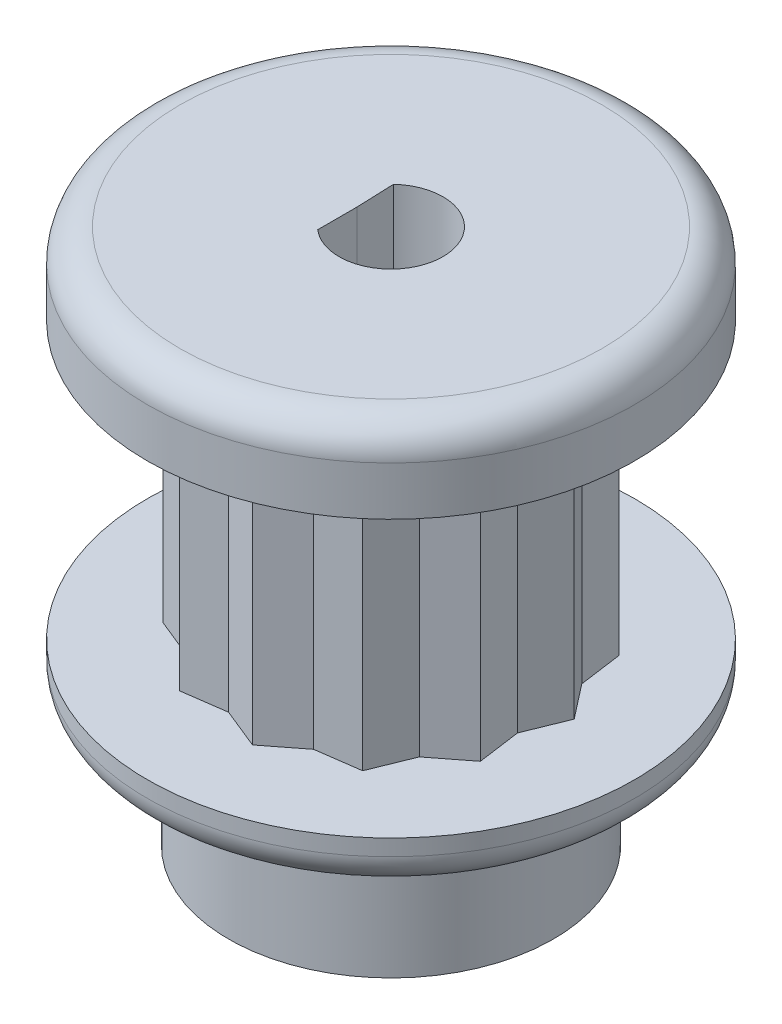
ISO-10303-21;
HEADER;
FILE_DESCRIPTION(('STEP AP214'),'2;1');
FILE_NAME('part.step','',(''),(''),'','','');
FILE_SCHEMA(('AUTOMOTIVE_DESIGN { 1 0 10303 214 1 1 1 1 }'));
ENDSEC;
DATA;
#1=APPLICATION_CONTEXT('core data for automotive mechanical design processes');
#2=APPLICATION_PROTOCOL_DEFINITION('international standard','automotive_design',2000,#1);
#3=PRODUCT_CONTEXT('',#1,'mechanical');
#4=PRODUCT('Part','Part','',(#3));
#5=PRODUCT_RELATED_PRODUCT_CATEGORY('part','',(#4));
#6=PRODUCT_DEFINITION_FORMATION('','',#4);
#7=PRODUCT_DEFINITION_CONTEXT('part definition',#1,'design');
#8=PRODUCT_DEFINITION('design','',#6,#7);
#9=PRODUCT_DEFINITION_SHAPE('','',#8);
#10=(LENGTH_UNIT() NAMED_UNIT(*) SI_UNIT(.MILLI.,.METRE.));
#11=(NAMED_UNIT(*) PLANE_ANGLE_UNIT() SI_UNIT($,.RADIAN.));
#12=(NAMED_UNIT(*) SI_UNIT($,.STERADIAN.) SOLID_ANGLE_UNIT());
#13=UNCERTAINTY_MEASURE_WITH_UNIT(LENGTH_MEASURE(1.E-05),#10,'distance_accuracy_value','');
#14=(GEOMETRIC_REPRESENTATION_CONTEXT(3) GLOBAL_UNCERTAINTY_ASSIGNED_CONTEXT((#13)) GLOBAL_UNIT_ASSIGNED_CONTEXT((#10,
#11,#12)) REPRESENTATION_CONTEXT('',''));
#15=CARTESIAN_POINT('',(0.,0.,0.));
#16=DIRECTION('',(0.,0.,1.));
#17=DIRECTION('',(1.,0.,0.));
#18=AXIS2_PLACEMENT_3D('',#15,#16,#17);
#19=CARTESIAN_POINT('',(4.12927398206627,8.5,-1.74507473002298));
#20=DIRECTION('',(-0.990486823740842,0.,0.13760760151888));
#21=DIRECTION('',(0.13760760151888,0.,0.990486823740842));
#22=AXIS2_PLACEMENT_3D('',#19,#20,#21);
#23=PLANE('',#22);
#24=DIRECTION('',(-0.13760760151888,0.,-0.990486823740842));
#25=VECTOR('',#24,1.);
#26=CARTESIAN_POINT('',(4.12927398206627,0.,-1.74507473002298));
#27=LINE('',#26,#25);
#28=CARTESIAN_POINT('',(4.12927398206627,0.,-1.74507473002298));
#29=VERTEX_POINT('',#28);
#30=CARTESIAN_POINT('',(3.94491475356944,0.,-3.07207545269808));
#31=VERTEX_POINT('',#30);
#32=EDGE_CURVE('E259',#29,#31,#27,.T.);
#33=ORIENTED_EDGE('',*,*,#32,.T.);
#34=DIRECTION('',(0.,-1.,0.));
#35=VECTOR('',#34,1.);
#36=CARTESIAN_POINT('',(3.94491475356944,8.5,-3.07207545269808));
#37=LINE('',#36,#35);
#38=CARTESIAN_POINT('',(3.94491475356944,8.5,-3.07207545269808));
#39=VERTEX_POINT('',#38);
#40=EDGE_CURVE('E253',#39,#31,#37,.T.);
#41=ORIENTED_EDGE('',*,*,#40,.F.);
#42=DIRECTION('',(-0.13760760151888,0.,-0.990486823740842));
#43=VECTOR('',#42,1.);
#44=CARTESIAN_POINT('',(4.12927398206627,8.5,-1.74507473002298));
#45=LINE('',#44,#43);
#46=CARTESIAN_POINT('',(4.12927398206627,8.5,-1.74507473002298));
#47=VERTEX_POINT('',#46);
#48=EDGE_CURVE('E260',#47,#39,#45,.T.);
#49=ORIENTED_EDGE('',*,*,#48,.F.);
#50=DIRECTION('',(0.,-1.,0.));
#51=VECTOR('',#50,1.);
#52=CARTESIAN_POINT('',(4.12927398206627,8.5,-1.74507473002298));
#53=LINE('',#52,#51);
#54=EDGE_CURVE('E333',#47,#29,#53,.T.);
#55=ORIENTED_EDGE('',*,*,#54,.T.);
#56=EDGE_LOOP('',(#33,#41,#49,#55));
#57=FACE_BOUND('',#56,.T.);
#58=ADVANCED_FACE('F33',(#57),#23,.F.);
#59=CARTESIAN_POINT('',(3.94491475356944,8.5,-3.07207545269808));
#60=DIRECTION('',(-0.376071733201224,0.,0.926590552232769));
#61=DIRECTION('',(0.926590552232769,0.,0.376071733201224));
#62=AXIS2_PLACEMENT_3D('',#59,#60,#61);
#63=PLANE('',#62);
#64=DIRECTION('',(-0.926590552232769,0.,-0.376071733201224));
#65=VECTOR('',#64,1.);
#66=CARTESIAN_POINT('',(3.94491475356944,0.,-3.07207545269808));
#67=LINE('',#66,#65);
#68=CARTESIAN_POINT('',(2.70351880264404,0.,-3.57591603873529));
#69=VERTEX_POINT('',#68);
#70=EDGE_CURVE('E336',#31,#69,#67,.T.);
#71=ORIENTED_EDGE('',*,*,#70,.T.);
#72=DIRECTION('',(0.,-1.,0.));
#73=VECTOR('',#72,1.);
#74=CARTESIAN_POINT('',(2.70351880264404,8.5,-3.57591603873529));
#75=LINE('',#74,#73);
#76=CARTESIAN_POINT('',(2.70351880264404,8.5,-3.57591603873529));
#77=VERTEX_POINT('',#76);
#78=EDGE_CURVE('E469',#77,#69,#75,.T.);
#79=ORIENTED_EDGE('',*,*,#78,.F.);
#80=DIRECTION('',(-0.926590552232769,0.,-0.376071733201224));
#81=VECTOR('',#80,1.);
#82=CARTESIAN_POINT('',(3.94491475356944,8.5,-3.07207545269808));
#83=LINE('',#82,#81);
#84=EDGE_CURVE('E263',#39,#77,#83,.T.);
#85=ORIENTED_EDGE('',*,*,#84,.F.);
#86=ORIENTED_EDGE('',*,*,#40,.T.);
#87=EDGE_LOOP('',(#71,#79,#85,#86));
#88=FACE_BOUND('',#87,.T.);
#89=ADVANCED_FACE('F494',(#88),#63,.F.);
#90=CARTESIAN_POINT('',(2.70351880264404,8.5,-3.57591603873529));
#91=DIRECTION('',(-0.788982950713883,0.,0.614415090539624));
#92=DIRECTION('',(0.614415090539624,0.,0.788982950713883));
#93=AXIS2_PLACEMENT_3D('',#90,#91,#92);
#94=PLANE('',#93);
#95=DIRECTION('',(-0.614415090539624,0.,-0.788982950713883));
#96=VECTOR('',#95,1.);
#97=CARTESIAN_POINT('',(2.70351880264404,0.,-3.57591603873529));
#98=LINE('',#97,#96);
#99=CARTESIAN_POINT('',(1.88035866600608,0.,-4.63295276116386));
#100=VERTEX_POINT('',#99);
#101=EDGE_CURVE('E339',#69,#100,#98,.T.);
#102=ORIENTED_EDGE('',*,*,#101,.T.);
#103=DIRECTION('',(0.,-1.,0.));
#104=VECTOR('',#103,1.);
#105=CARTESIAN_POINT('',(1.88035866600608,8.5,-4.63295276116386));
#106=LINE('',#105,#104);
#107=CARTESIAN_POINT('',(1.88035866600608,8.5,-4.63295276116386));
#108=VERTEX_POINT('',#107);
#109=EDGE_CURVE('E466',#108,#100,#106,.T.);
#110=ORIENTED_EDGE('',*,*,#109,.F.);
#111=DIRECTION('',(-0.614415090539624,0.,-0.788982950713883));
#112=VECTOR('',#111,1.);
#113=CARTESIAN_POINT('',(2.70351880264404,8.5,-3.57591603873529));
#114=LINE('',#113,#112);
#115=EDGE_CURVE('E267',#77,#108,#114,.T.);
#116=ORIENTED_EDGE('',*,*,#115,.F.);
#117=ORIENTED_EDGE('',*,*,#78,.T.);
#118=EDGE_LOOP('',(#102,#110,#116,#117));
#119=FACE_BOUND('',#118,.T.);
#120=ADVANCED_FACE('F500',(#119),#94,.F.);
#121=CARTESIAN_POINT('',(1.88035866600608,8.5,-4.63295276116386));
#122=DIRECTION('',(0.137607601518888,0.,0.990486823740841));
#123=DIRECTION('',(0.990486823740841,0.,-0.137607601518888));
#124=AXIS2_PLACEMENT_3D('',#121,#122,#123);
#125=PLANE('',#124);
#126=DIRECTION('',(-0.990486823740841,0.,0.137607601518888));
#127=VECTOR('',#126,1.);
#128=CARTESIAN_POINT('',(1.88035866600608,0.,-4.63295276116386));
#129=LINE('',#128,#127);
#130=CARTESIAN_POINT('',(0.553357943330975,0.,-4.44859353266701));
#131=VERTEX_POINT('',#130);
#132=EDGE_CURVE('E342',#100,#131,#129,.T.);
#133=ORIENTED_EDGE('',*,*,#132,.T.);
#134=DIRECTION('',(0.,-1.,0.));
#135=VECTOR('',#134,1.);
#136=CARTESIAN_POINT('',(0.553357943330975,8.5,-4.44859353266701));
#137=LINE('',#136,#135);
#138=CARTESIAN_POINT('',(0.553357943330975,8.5,-4.44859353266701));
#139=VERTEX_POINT('',#138);
#140=EDGE_CURVE('E463',#139,#131,#137,.T.);
#141=ORIENTED_EDGE('',*,*,#140,.F.);
#142=DIRECTION('',(-0.990486823740841,0.,0.137607601518888));
#143=VECTOR('',#142,1.);
#144=CARTESIAN_POINT('',(1.88035866600608,8.5,-4.63295276116386));
#145=LINE('',#144,#143);
#146=EDGE_CURVE('E270',#108,#139,#145,.T.);
#147=ORIENTED_EDGE('',*,*,#146,.F.);
#148=ORIENTED_EDGE('',*,*,#109,.T.);
#149=EDGE_LOOP('',(#133,#141,#147,#148));
#150=FACE_BOUND('',#149,.T.);
#151=ADVANCED_FACE('F506',(#150),#125,.F.);
#152=CARTESIAN_POINT('',(0.553357943330975,8.5,-4.44859353266701));
#153=DIRECTION('',(-0.376071733201224,0.,0.926590552232769));
#154=DIRECTION('',(0.926590552232769,0.,0.376071733201224));
#155=AXIS2_PLACEMENT_3D('',#152,#153,#154);
#156=PLANE('',#155);
#157=DIRECTION('',(-0.926590552232769,0.,-0.376071733201224));
#158=VECTOR('',#157,1.);
#159=CARTESIAN_POINT('',(0.553357943330975,0.,-4.44859353266701));
#160=LINE('',#159,#158);
#161=CARTESIAN_POINT('',(-0.688038007594398,0.,-4.9524341187042));
#162=VERTEX_POINT('',#161);
#163=EDGE_CURVE('E345',#131,#162,#160,.T.);
#164=ORIENTED_EDGE('',*,*,#163,.T.);
#165=DIRECTION('',(0.,-1.,0.));
#166=VECTOR('',#165,1.);
#167=CARTESIAN_POINT('',(-0.688038007594398,8.5,-4.9524341187042));
#168=LINE('',#167,#166);
#169=CARTESIAN_POINT('',(-0.688038007594398,8.5,-4.9524341187042));
#170=VERTEX_POINT('',#169);
#171=EDGE_CURVE('E460',#170,#162,#168,.T.);
#172=ORIENTED_EDGE('',*,*,#171,.F.);
#173=DIRECTION('',(-0.926590552232769,0.,-0.376071733201224));
#174=VECTOR('',#173,1.);
#175=CARTESIAN_POINT('',(0.553357943330975,8.5,-4.44859353266701));
#176=LINE('',#175,#174);
#177=EDGE_CURVE('E273',#139,#170,#176,.T.);
#178=ORIENTED_EDGE('',*,*,#177,.F.);
#179=ORIENTED_EDGE('',*,*,#140,.T.);
#180=EDGE_LOOP('',(#164,#172,#178,#179));
#181=FACE_BOUND('',#180,.T.);
#182=ADVANCED_FACE('F510',(#181),#156,.F.);
#183=CARTESIAN_POINT('',(-0.688038007594398,8.5,-4.9524341187042));
#184=DIRECTION('',(0.614415090539618,0.,0.788982950713888));
#185=DIRECTION('',(0.788982950713888,0.,-0.614415090539618));
#186=AXIS2_PLACEMENT_3D('',#183,#184,#185);
#187=PLANE('',#186);
#188=DIRECTION('',(-0.788982950713888,0.,0.614415090539618));
#189=VECTOR('',#188,1.);
#190=CARTESIAN_POINT('',(-0.688038007594398,0.,-4.9524341187042));
#191=LINE('',#190,#189);
#192=CARTESIAN_POINT('',(-1.74507473002296,0.,-4.12927398206627));
#193=VERTEX_POINT('',#192);
#194=EDGE_CURVE('E348',#162,#193,#191,.T.);
#195=ORIENTED_EDGE('',*,*,#194,.T.);
#196=DIRECTION('',(0.,-1.,0.));
#197=VECTOR('',#196,1.);
#198=CARTESIAN_POINT('',(-1.74507473002296,8.5,-4.12927398206627));
#199=LINE('',#198,#197);
#200=CARTESIAN_POINT('',(-1.74507473002296,8.5,-4.12927398206627));
#201=VERTEX_POINT('',#200);
#202=EDGE_CURVE('E457',#201,#193,#199,.T.);
#203=ORIENTED_EDGE('',*,*,#202,.F.);
#204=DIRECTION('',(-0.788982950713888,0.,0.614415090539618));
#205=VECTOR('',#204,1.);
#206=CARTESIAN_POINT('',(-0.688038007594398,8.5,-4.9524341187042));
#207=LINE('',#206,#205);
#208=EDGE_CURVE('E276',#170,#201,#207,.T.);
#209=ORIENTED_EDGE('',*,*,#208,.F.);
#210=ORIENTED_EDGE('',*,*,#171,.T.);
#211=EDGE_LOOP('',(#195,#203,#209,#210));
#212=FACE_BOUND('',#211,.T.);
#213=ADVANCED_FACE('F514',(#212),#187,.F.);
#214=CARTESIAN_POINT('',(-1.74507473002296,8.5,-4.12927398206627));
#215=DIRECTION('',(0.137607601518888,0.,0.990486823740841));
#216=DIRECTION('',(0.990486823740841,0.,-0.137607601518888));
#217=AXIS2_PLACEMENT_3D('',#214,#215,#216);
#218=PLANE('',#217);
#219=DIRECTION('',(-0.99048682374084,0.,0.137607601518888));
#220=VECTOR('',#219,1.);
#221=CARTESIAN_POINT('',(-1.74507473002296,0.,-4.12927398206627));
#222=LINE('',#221,#220);
#223=CARTESIAN_POINT('',(-3.07207545269811,0.,-3.94491475356942));
#224=VERTEX_POINT('',#223);
#225=EDGE_CURVE('E351',#193,#224,#222,.T.);
#226=ORIENTED_EDGE('',*,*,#225,.T.);
#227=DIRECTION('',(0.,-1.,0.));
#228=VECTOR('',#227,1.);
#229=CARTESIAN_POINT('',(-3.07207545269811,8.5,-3.94491475356942));
#230=LINE('',#229,#228);
#231=CARTESIAN_POINT('',(-3.07207545269811,8.5,-3.94491475356942));
#232=VERTEX_POINT('',#231);
#233=EDGE_CURVE('E454',#232,#224,#230,.T.);
#234=ORIENTED_EDGE('',*,*,#233,.F.);
#235=DIRECTION('',(-0.99048682374084,0.,0.137607601518888));
#236=VECTOR('',#235,1.);
#237=CARTESIAN_POINT('',(-1.74507473002296,8.5,-4.12927398206627));
#238=LINE('',#237,#236);
#239=EDGE_CURVE('E279',#201,#232,#238,.T.);
#240=ORIENTED_EDGE('',*,*,#239,.F.);
#241=ORIENTED_EDGE('',*,*,#202,.T.);
#242=EDGE_LOOP('',(#226,#234,#240,#241));
#243=FACE_BOUND('',#242,.T.);
#244=ADVANCED_FACE('F518',(#243),#218,.F.);
#245=CARTESIAN_POINT('',(-3.07207545269811,8.5,-3.94491475356942));
#246=DIRECTION('',(0.926590552232772,0.,0.376071733201218));
#247=DIRECTION('',(0.376071733201218,0.,-0.926590552232772));
#248=AXIS2_PLACEMENT_3D('',#245,#246,#247);
#249=PLANE('',#248);
#250=DIRECTION('',(-0.376071733201217,0.,0.926590552232772));
#251=VECTOR('',#250,1.);
#252=CARTESIAN_POINT('',(-3.07207545269811,0.,-3.94491475356942));
#253=LINE('',#252,#251);
#254=CARTESIAN_POINT('',(-3.5759160387353,0.,-2.70351880264403));
#255=VERTEX_POINT('',#254);
#256=EDGE_CURVE('E354',#224,#255,#253,.T.);
#257=ORIENTED_EDGE('',*,*,#256,.T.);
#258=DIRECTION('',(0.,-1.,0.));
#259=VECTOR('',#258,1.);
#260=CARTESIAN_POINT('',(-3.5759160387353,8.5,-2.70351880264403));
#261=LINE('',#260,#259);
#262=CARTESIAN_POINT('',(-3.5759160387353,8.5,-2.70351880264403));
#263=VERTEX_POINT('',#262);
#264=EDGE_CURVE('E451',#263,#255,#261,.T.);
#265=ORIENTED_EDGE('',*,*,#264,.F.);
#266=DIRECTION('',(-0.376071733201217,0.,0.926590552232772));
#267=VECTOR('',#266,1.);
#268=CARTESIAN_POINT('',(-3.07207545269811,8.5,-3.94491475356942));
#269=LINE('',#268,#267);
#270=EDGE_CURVE('E282',#232,#263,#269,.T.);
#271=ORIENTED_EDGE('',*,*,#270,.F.);
#272=ORIENTED_EDGE('',*,*,#233,.T.);
#273=EDGE_LOOP('',(#257,#265,#271,#272));
#274=FACE_BOUND('',#273,.T.);
#275=ADVANCED_FACE('F522',(#274),#249,.F.);
#276=CARTESIAN_POINT('',(-3.5759160387353,8.5,-2.70351880264403));
#277=DIRECTION('',(0.614415090539617,0.,0.788982950713888));
#278=DIRECTION('',(0.788982950713888,0.,-0.614415090539617));
#279=AXIS2_PLACEMENT_3D('',#276,#277,#278);
#280=PLANE('',#279);
#281=DIRECTION('',(-0.788982950713888,0.,0.614415090539617));
#282=VECTOR('',#281,1.);
#283=CARTESIAN_POINT('',(-3.5759160387353,0.,-2.70351880264403));
#284=LINE('',#283,#282);
#285=CARTESIAN_POINT('',(-4.63295276116384,0.,-1.88035866600612));
#286=VERTEX_POINT('',#285);
#287=EDGE_CURVE('E357',#255,#286,#284,.T.);
#288=ORIENTED_EDGE('',*,*,#287,.T.);
#289=DIRECTION('',(0.,-1.,0.));
#290=VECTOR('',#289,1.);
#291=CARTESIAN_POINT('',(-4.63295276116384,8.5,-1.88035866600612));
#292=LINE('',#291,#290);
#293=CARTESIAN_POINT('',(-4.63295276116384,8.5,-1.88035866600612));
#294=VERTEX_POINT('',#293);
#295=EDGE_CURVE('E448',#294,#286,#292,.T.);
#296=ORIENTED_EDGE('',*,*,#295,.F.);
#297=DIRECTION('',(-0.788982950713888,0.,0.614415090539617));
#298=VECTOR('',#297,1.);
#299=CARTESIAN_POINT('',(-3.5759160387353,8.5,-2.70351880264403));
#300=LINE('',#299,#298);
#301=EDGE_CURVE('E285',#263,#294,#300,.T.);
#302=ORIENTED_EDGE('',*,*,#301,.F.);
#303=ORIENTED_EDGE('',*,*,#264,.T.);
#304=EDGE_LOOP('',(#288,#296,#302,#303));
#305=FACE_BOUND('',#304,.T.);
#306=ADVANCED_FACE('F526',(#305),#280,.F.);
#307=CARTESIAN_POINT('',(-4.63295276116384,8.5,-1.88035866600612));
#308=DIRECTION('',(0.990486823740842,0.,-0.13760760151888));
#309=DIRECTION('',(-0.13760760151888,0.,-0.990486823740842));
#310=AXIS2_PLACEMENT_3D('',#307,#308,#309);
#311=PLANE('',#310);
#312=DIRECTION('',(0.13760760151888,0.,0.990486823740842));
#313=VECTOR('',#312,1.);
#314=CARTESIAN_POINT('',(-4.63295276116384,0.,-1.88035866600612));
#315=LINE('',#314,#313);
#316=CARTESIAN_POINT('',(-4.448593532667,0.,-0.553357943330972));
#317=VERTEX_POINT('',#316);
#318=EDGE_CURVE('E360',#286,#317,#315,.T.);
#319=ORIENTED_EDGE('',*,*,#318,.T.);
#320=DIRECTION('',(0.,-1.,0.));
#321=VECTOR('',#320,1.);
#322=CARTESIAN_POINT('',(-4.448593532667,8.5,-0.553357943330972));
#323=LINE('',#322,#321);
#324=CARTESIAN_POINT('',(-4.448593532667,8.5,-0.553357943330972));
#325=VERTEX_POINT('',#324);
#326=EDGE_CURVE('E445',#325,#317,#323,.T.);
#327=ORIENTED_EDGE('',*,*,#326,.F.);
#328=DIRECTION('',(0.13760760151888,0.,0.990486823740842));
#329=VECTOR('',#328,1.);
#330=CARTESIAN_POINT('',(-4.63295276116384,8.5,-1.88035866600612));
#331=LINE('',#330,#329);
#332=EDGE_CURVE('E288',#294,#325,#331,.T.);
#333=ORIENTED_EDGE('',*,*,#332,.F.);
#334=ORIENTED_EDGE('',*,*,#295,.T.);
#335=EDGE_LOOP('',(#319,#327,#333,#334));
#336=FACE_BOUND('',#335,.T.);
#337=ADVANCED_FACE('F530',(#336),#311,.F.);
#338=CARTESIAN_POINT('',(-4.448593532667,8.5,-0.553357943330972));
#339=DIRECTION('',(0.926590552232772,0.,0.376071733201217));
#340=DIRECTION('',(0.376071733201217,0.,-0.926590552232772));
#341=AXIS2_PLACEMENT_3D('',#338,#339,#340);
#342=PLANE('',#341);
#343=DIRECTION('',(-0.376071733201217,0.,0.926590552232772));
#344=VECTOR('',#343,1.);
#345=CARTESIAN_POINT('',(-4.448593532667,0.,-0.553357943330972));
#346=LINE('',#345,#344);
#347=CARTESIAN_POINT('',(-4.9524341187042,0.,0.68803800759444));
#348=VERTEX_POINT('',#347);
#349=EDGE_CURVE('E363',#317,#348,#346,.T.);
#350=ORIENTED_EDGE('',*,*,#349,.T.);
#351=DIRECTION('',(0.,-1.,0.));
#352=VECTOR('',#351,1.);
#353=CARTESIAN_POINT('',(-4.9524341187042,8.5,0.68803800759444));
#354=LINE('',#353,#352);
#355=CARTESIAN_POINT('',(-4.9524341187042,8.5,0.68803800759444));
#356=VERTEX_POINT('',#355);
#357=EDGE_CURVE('E442',#356,#348,#354,.T.);
#358=ORIENTED_EDGE('',*,*,#357,.F.);
#359=DIRECTION('',(-0.376071733201217,0.,0.926590552232772));
#360=VECTOR('',#359,1.);
#361=CARTESIAN_POINT('',(-4.448593532667,8.5,-0.553357943330972));
#362=LINE('',#361,#360);
#363=EDGE_CURVE('E291',#325,#356,#362,.T.);
#364=ORIENTED_EDGE('',*,*,#363,.F.);
#365=ORIENTED_EDGE('',*,*,#326,.T.);
#366=EDGE_LOOP('',(#350,#358,#364,#365));
#367=FACE_BOUND('',#366,.T.);
#368=ADVANCED_FACE('F534',(#367),#342,.F.);
#369=CARTESIAN_POINT('',(-4.9524341187042,8.5,0.68803800759444));
#370=DIRECTION('',(0.788982950713884,0.,-0.614415090539624));
#371=DIRECTION('',(-0.614415090539623,0.,-0.788982950713883));
#372=AXIS2_PLACEMENT_3D('',#369,#370,#371);
#373=PLANE('',#372);
#374=DIRECTION('',(0.614415090539623,0.,0.788982950713884));
#375=VECTOR('',#374,1.);
#376=CARTESIAN_POINT('',(-4.9524341187042,0.,0.68803800759444));
#377=LINE('',#376,#375);
#378=CARTESIAN_POINT('',(-4.12927398206627,0.,1.74507473002297));
#379=VERTEX_POINT('',#378);
#380=EDGE_CURVE('E366',#348,#379,#377,.T.);
#381=ORIENTED_EDGE('',*,*,#380,.T.);
#382=DIRECTION('',(0.,-1.,0.));
#383=VECTOR('',#382,1.);
#384=CARTESIAN_POINT('',(-4.12927398206627,8.5,1.74507473002297));
#385=LINE('',#384,#383);
#386=CARTESIAN_POINT('',(-4.12927398206627,8.5,1.74507473002297));
#387=VERTEX_POINT('',#386);
#388=EDGE_CURVE('E439',#387,#379,#385,.T.);
#389=ORIENTED_EDGE('',*,*,#388,.F.);
#390=DIRECTION('',(0.614415090539623,0.,0.788982950713884));
#391=VECTOR('',#390,1.);
#392=CARTESIAN_POINT('',(-4.9524341187042,8.5,0.68803800759444));
#393=LINE('',#392,#391);
#394=EDGE_CURVE('E294',#356,#387,#393,.T.);
#395=ORIENTED_EDGE('',*,*,#394,.F.);
#396=ORIENTED_EDGE('',*,*,#357,.T.);
#397=EDGE_LOOP('',(#381,#389,#395,#396));
#398=FACE_BOUND('',#397,.T.);
#399=ADVANCED_FACE('F538',(#398),#373,.F.);
#400=CARTESIAN_POINT('',(-4.12927398206627,8.5,1.74507473002297));
#401=DIRECTION('',(0.990486823740842,0.,-0.137607601518881));
#402=DIRECTION('',(-0.137607601518881,0.,-0.990486823740842));
#403=AXIS2_PLACEMENT_3D('',#400,#401,#402);
#404=PLANE('',#403);
#405=DIRECTION('',(0.137607601518881,0.,0.990486823740841));
#406=VECTOR('',#405,1.);
#407=CARTESIAN_POINT('',(-4.12927398206627,0.,1.74507473002297));
#408=LINE('',#407,#406);
#409=CARTESIAN_POINT('',(-3.94491475356944,0.,3.07207545269808));
#410=VERTEX_POINT('',#409);
#411=EDGE_CURVE('E369',#379,#410,#408,.T.);
#412=ORIENTED_EDGE('',*,*,#411,.T.);
#413=DIRECTION('',(0.,-1.,0.));
#414=VECTOR('',#413,1.);
#415=CARTESIAN_POINT('',(-3.94491475356944,8.5,3.07207545269808));
#416=LINE('',#415,#414);
#417=CARTESIAN_POINT('',(-3.94491475356944,8.5,3.07207545269808));
#418=VERTEX_POINT('',#417);
#419=EDGE_CURVE('E436',#418,#410,#416,.T.);
#420=ORIENTED_EDGE('',*,*,#419,.F.);
#421=DIRECTION('',(0.137607601518881,0.,0.990486823740841));
#422=VECTOR('',#421,1.);
#423=CARTESIAN_POINT('',(-4.12927398206627,8.5,1.74507473002297));
#424=LINE('',#423,#422);
#425=EDGE_CURVE('E297',#387,#418,#424,.T.);
#426=ORIENTED_EDGE('',*,*,#425,.F.);
#427=ORIENTED_EDGE('',*,*,#388,.T.);
#428=EDGE_LOOP('',(#412,#420,#426,#427));
#429=FACE_BOUND('',#428,.T.);
#430=ADVANCED_FACE('F542',(#429),#404,.F.);
#431=CARTESIAN_POINT('',(-3.94491475356944,8.5,3.07207545269808));
#432=DIRECTION('',(0.376071733201225,0.,-0.926590552232768));
#433=DIRECTION('',(-0.926590552232769,0.,-0.376071733201225));
#434=AXIS2_PLACEMENT_3D('',#431,#432,#433);
#435=PLANE('',#434);
#436=DIRECTION('',(0.926590552232769,0.,0.376071733201225));
#437=VECTOR('',#436,1.);
#438=CARTESIAN_POINT('',(-3.94491475356944,0.,3.07207545269808));
#439=LINE('',#438,#437);
#440=CARTESIAN_POINT('',(-2.70351880264403,0.,3.57591603873529));
#441=VERTEX_POINT('',#440);
#442=EDGE_CURVE('E372',#410,#441,#439,.T.);
#443=ORIENTED_EDGE('',*,*,#442,.T.);
#444=DIRECTION('',(0.,-1.,0.));
#445=VECTOR('',#444,1.);
#446=CARTESIAN_POINT('',(-2.70351880264403,8.5,3.57591603873529));
#447=LINE('',#446,#445);
#448=CARTESIAN_POINT('',(-2.70351880264403,8.5,3.57591603873529));
#449=VERTEX_POINT('',#448);
#450=EDGE_CURVE('E433',#449,#441,#447,.T.);
#451=ORIENTED_EDGE('',*,*,#450,.F.);
#452=DIRECTION('',(0.926590552232769,0.,0.376071733201225));
#453=VECTOR('',#452,1.);
#454=CARTESIAN_POINT('',(-3.94491475356944,8.5,3.07207545269808));
#455=LINE('',#454,#453);
#456=EDGE_CURVE('E300',#418,#449,#455,.T.);
#457=ORIENTED_EDGE('',*,*,#456,.F.);
#458=ORIENTED_EDGE('',*,*,#419,.T.);
#459=EDGE_LOOP('',(#443,#451,#457,#458));
#460=FACE_BOUND('',#459,.T.);
#461=ADVANCED_FACE('F546',(#460),#435,.F.);
#462=CARTESIAN_POINT('',(-2.70351880264403,8.5,3.57591603873529));
#463=DIRECTION('',(0.788982950713884,0.,-0.614415090539624));
#464=DIRECTION('',(-0.614415090539623,0.,-0.788982950713883));
#465=AXIS2_PLACEMENT_3D('',#462,#463,#464);
#466=PLANE('',#465);
#467=DIRECTION('',(0.614415090539623,0.,0.788982950713884));
#468=VECTOR('',#467,1.);
#469=CARTESIAN_POINT('',(-2.70351880264403,0.,3.57591603873529));
#470=LINE('',#469,#468);
#471=CARTESIAN_POINT('',(-1.88035866600608,0.,4.63295276116386));
#472=VERTEX_POINT('',#471);
#473=EDGE_CURVE('E375',#441,#472,#470,.T.);
#474=ORIENTED_EDGE('',*,*,#473,.T.);
#475=DIRECTION('',(0.,-1.,0.));
#476=VECTOR('',#475,1.);
#477=CARTESIAN_POINT('',(-1.88035866600608,8.5,4.63295276116386));
#478=LINE('',#477,#476);
#479=CARTESIAN_POINT('',(-1.88035866600608,8.5,4.63295276116386));
#480=VERTEX_POINT('',#479);
#481=EDGE_CURVE('E430',#480,#472,#478,.T.);
#482=ORIENTED_EDGE('',*,*,#481,.F.);
#483=DIRECTION('',(0.614415090539623,0.,0.788982950713884));
#484=VECTOR('',#483,1.);
#485=CARTESIAN_POINT('',(-2.70351880264403,8.5,3.57591603873529));
#486=LINE('',#485,#484);
#487=EDGE_CURVE('E303',#449,#480,#486,.T.);
#488=ORIENTED_EDGE('',*,*,#487,.F.);
#489=ORIENTED_EDGE('',*,*,#450,.T.);
#490=EDGE_LOOP('',(#474,#482,#488,#489));
#491=FACE_BOUND('',#490,.T.);
#492=ADVANCED_FACE('F550',(#491),#466,.F.);
#493=CARTESIAN_POINT('',(-1.88035866600608,8.5,4.63295276116386));
#494=DIRECTION('',(-0.137607601518888,0.,-0.990486823740841));
#495=DIRECTION('',(-0.990486823740841,0.,0.137607601518888));
#496=AXIS2_PLACEMENT_3D('',#493,#494,#495);
#497=PLANE('',#496);
#498=DIRECTION('',(0.990486823740841,0.,-0.137607601518888));
#499=VECTOR('',#498,1.);
#500=CARTESIAN_POINT('',(-1.88035866600608,0.,4.63295276116386));
#501=LINE('',#500,#499);
#502=CARTESIAN_POINT('',(-0.553357943330968,0.,4.44859353266701));
#503=VERTEX_POINT('',#502);
#504=EDGE_CURVE('E378',#472,#503,#501,.T.);
#505=ORIENTED_EDGE('',*,*,#504,.T.);
#506=DIRECTION('',(0.,-1.,0.));
#507=VECTOR('',#506,1.);
#508=CARTESIAN_POINT('',(-0.553357943330968,8.5,4.44859353266701));
#509=LINE('',#508,#507);
#510=CARTESIAN_POINT('',(-0.553357943330968,8.5,4.44859353266701));
#511=VERTEX_POINT('',#510);
#512=EDGE_CURVE('E427',#511,#503,#509,.T.);
#513=ORIENTED_EDGE('',*,*,#512,.F.);
#514=DIRECTION('',(0.990486823740841,0.,-0.137607601518888));
#515=VECTOR('',#514,1.);
#516=CARTESIAN_POINT('',(-1.88035866600608,8.5,4.63295276116386));
#517=LINE('',#516,#515);
#518=EDGE_CURVE('E306',#480,#511,#517,.T.);
#519=ORIENTED_EDGE('',*,*,#518,.F.);
#520=ORIENTED_EDGE('',*,*,#481,.T.);
#521=EDGE_LOOP('',(#505,#513,#519,#520));
#522=FACE_BOUND('',#521,.T.);
#523=ADVANCED_FACE('F554',(#522),#497,.F.);
#524=CARTESIAN_POINT('',(-0.553357943330968,8.5,4.44859353266701));
#525=DIRECTION('',(0.376071733201225,0.,-0.926590552232769));
#526=DIRECTION('',(-0.926590552232768,0.,-0.376071733201225));
#527=AXIS2_PLACEMENT_3D('',#524,#525,#526);
#528=PLANE('',#527);
#529=DIRECTION('',(0.926590552232768,0.,0.376071733201225));
#530=VECTOR('',#529,1.);
#531=CARTESIAN_POINT('',(-0.553357943330968,0.,4.44859353266701));
#532=LINE('',#531,#530);
#533=CARTESIAN_POINT('',(0.688038007594398,0.,4.9524341187042));
#534=VERTEX_POINT('',#533);
#535=EDGE_CURVE('E381',#503,#534,#532,.T.);
#536=ORIENTED_EDGE('',*,*,#535,.T.);
#537=DIRECTION('',(0.,-1.,0.));
#538=VECTOR('',#537,1.);
#539=CARTESIAN_POINT('',(0.688038007594398,8.5,4.9524341187042));
#540=LINE('',#539,#538);
#541=CARTESIAN_POINT('',(0.688038007594398,8.5,4.9524341187042));
#542=VERTEX_POINT('',#541);
#543=EDGE_CURVE('E424',#542,#534,#540,.T.);
#544=ORIENTED_EDGE('',*,*,#543,.F.);
#545=DIRECTION('',(0.926590552232768,0.,0.376071733201225));
#546=VECTOR('',#545,1.);
#547=CARTESIAN_POINT('',(-0.553357943330968,8.5,4.44859353266701));
#548=LINE('',#547,#546);
#549=EDGE_CURVE('E309',#511,#542,#548,.T.);
#550=ORIENTED_EDGE('',*,*,#549,.F.);
#551=ORIENTED_EDGE('',*,*,#512,.T.);
#552=EDGE_LOOP('',(#536,#544,#550,#551));
#553=FACE_BOUND('',#552,.T.);
#554=ADVANCED_FACE('F558',(#553),#528,.F.);
#555=CARTESIAN_POINT('',(0.688038007594398,8.5,4.9524341187042));
#556=DIRECTION('',(-0.614415090539617,0.,-0.788982950713889));
#557=DIRECTION('',(-0.788982950713888,0.,0.614415090539617));
#558=AXIS2_PLACEMENT_3D('',#555,#556,#557);
#559=PLANE('',#558);
#560=DIRECTION('',(0.788982950713888,0.,-0.614415090539617));
#561=VECTOR('',#560,1.);
#562=CARTESIAN_POINT('',(0.688038007594398,0.,4.9524341187042));
#563=LINE('',#562,#561);
#564=CARTESIAN_POINT('',(1.74507473002296,0.,4.12927398206627));
#565=VERTEX_POINT('',#564);
#566=EDGE_CURVE('E384',#534,#565,#563,.T.);
#567=ORIENTED_EDGE('',*,*,#566,.T.);
#568=DIRECTION('',(0.,-1.,0.));
#569=VECTOR('',#568,1.);
#570=CARTESIAN_POINT('',(1.74507473002296,8.5,4.12927398206627));
#571=LINE('',#570,#569);
#572=CARTESIAN_POINT('',(1.74507473002296,8.5,4.12927398206627));
#573=VERTEX_POINT('',#572);
#574=EDGE_CURVE('E421',#573,#565,#571,.T.);
#575=ORIENTED_EDGE('',*,*,#574,.F.);
#576=DIRECTION('',(0.788982950713888,0.,-0.614415090539617));
#577=VECTOR('',#576,1.);
#578=CARTESIAN_POINT('',(0.688038007594398,8.5,4.9524341187042));
#579=LINE('',#578,#577);
#580=EDGE_CURVE('E312',#542,#573,#579,.T.);
#581=ORIENTED_EDGE('',*,*,#580,.F.);
#582=ORIENTED_EDGE('',*,*,#543,.T.);
#583=EDGE_LOOP('',(#567,#575,#581,#582));
#584=FACE_BOUND('',#583,.T.);
#585=ADVANCED_FACE('F562',(#584),#559,.F.);
#586=CARTESIAN_POINT('',(1.74507473002296,8.5,4.12927398206627));
#587=DIRECTION('',(-0.137607601518888,0.,-0.990486823740841));
#588=DIRECTION('',(-0.990486823740841,0.,0.137607601518888));
#589=AXIS2_PLACEMENT_3D('',#586,#587,#588);
#590=PLANE('',#589);
#591=DIRECTION('',(0.99048682374084,0.,-0.137607601518888));
#592=VECTOR('',#591,1.);
#593=CARTESIAN_POINT('',(1.74507473002296,0.,4.12927398206627));
#594=LINE('',#593,#592);
#595=CARTESIAN_POINT('',(3.07207545269811,0.,3.94491475356942));
#596=VERTEX_POINT('',#595);
#597=EDGE_CURVE('E387',#565,#596,#594,.T.);
#598=ORIENTED_EDGE('',*,*,#597,.T.);
#599=DIRECTION('',(0.,-1.,0.));
#600=VECTOR('',#599,1.);
#601=CARTESIAN_POINT('',(3.07207545269811,8.5,3.94491475356942));
#602=LINE('',#601,#600);
#603=CARTESIAN_POINT('',(3.07207545269811,8.5,3.94491475356942));
#604=VERTEX_POINT('',#603);
#605=EDGE_CURVE('E418',#604,#596,#602,.T.);
#606=ORIENTED_EDGE('',*,*,#605,.F.);
#607=DIRECTION('',(0.99048682374084,0.,-0.137607601518888));
#608=VECTOR('',#607,1.);
#609=CARTESIAN_POINT('',(1.74507473002296,8.5,4.12927398206627));
#610=LINE('',#609,#608);
#611=EDGE_CURVE('E315',#573,#604,#610,.T.);
#612=ORIENTED_EDGE('',*,*,#611,.F.);
#613=ORIENTED_EDGE('',*,*,#574,.T.);
#614=EDGE_LOOP('',(#598,#606,#612,#613));
#615=FACE_BOUND('',#614,.T.);
#616=ADVANCED_FACE('F566',(#615),#590,.F.);
#617=CARTESIAN_POINT('',(3.07207545269811,8.5,3.94491475356942));
#618=DIRECTION('',(-0.926590552232772,0.,-0.376071733201218));
#619=DIRECTION('',(-0.376071733201218,0.,0.926590552232772));
#620=AXIS2_PLACEMENT_3D('',#617,#618,#619);
#621=PLANE('',#620);
#622=DIRECTION('',(0.376071733201217,0.,-0.926590552232771));
#623=VECTOR('',#622,1.);
#624=CARTESIAN_POINT('',(3.07207545269811,0.,3.94491475356942));
#625=LINE('',#624,#623);
#626=CARTESIAN_POINT('',(3.5759160387353,0.,2.70351880264403));
#627=VERTEX_POINT('',#626);
#628=EDGE_CURVE('E390',#596,#627,#625,.T.);
#629=ORIENTED_EDGE('',*,*,#628,.T.);
#630=DIRECTION('',(0.,-1.,0.));
#631=VECTOR('',#630,1.);
#632=CARTESIAN_POINT('',(3.5759160387353,8.5,2.70351880264403));
#633=LINE('',#632,#631);
#634=CARTESIAN_POINT('',(3.5759160387353,8.5,2.70351880264403));
#635=VERTEX_POINT('',#634);
#636=EDGE_CURVE('E415',#635,#627,#633,.T.);
#637=ORIENTED_EDGE('',*,*,#636,.F.);
#638=DIRECTION('',(0.376071733201217,0.,-0.926590552232771));
#639=VECTOR('',#638,1.);
#640=CARTESIAN_POINT('',(3.07207545269811,8.5,3.94491475356942));
#641=LINE('',#640,#639);
#642=EDGE_CURVE('E318',#604,#635,#641,.T.);
#643=ORIENTED_EDGE('',*,*,#642,.F.);
#644=ORIENTED_EDGE('',*,*,#605,.T.);
#645=EDGE_LOOP('',(#629,#637,#643,#644));
#646=FACE_BOUND('',#645,.T.);
#647=ADVANCED_FACE('F570',(#646),#621,.F.);
#648=CARTESIAN_POINT('',(3.5759160387353,8.5,2.70351880264403));
#649=DIRECTION('',(-0.614415090539617,0.,-0.788982950713888));
#650=DIRECTION('',(-0.788982950713888,0.,0.614415090539617));
#651=AXIS2_PLACEMENT_3D('',#648,#649,#650);
#652=PLANE('',#651);
#653=DIRECTION('',(0.788982950713888,0.,-0.614415090539617));
#654=VECTOR('',#653,1.);
#655=CARTESIAN_POINT('',(3.5759160387353,0.,2.70351880264403));
#656=LINE('',#655,#654);
#657=CARTESIAN_POINT('',(4.63295276116384,0.,1.88035866600612));
#658=VERTEX_POINT('',#657);
#659=EDGE_CURVE('E393',#627,#658,#656,.T.);
#660=ORIENTED_EDGE('',*,*,#659,.T.);
#661=DIRECTION('',(0.,-1.,0.));
#662=VECTOR('',#661,1.);
#663=CARTESIAN_POINT('',(4.63295276116384,8.5,1.88035866600612));
#664=LINE('',#663,#662);
#665=CARTESIAN_POINT('',(4.63295276116384,8.5,1.88035866600612));
#666=VERTEX_POINT('',#665);
#667=EDGE_CURVE('E412',#666,#658,#664,.T.);
#668=ORIENTED_EDGE('',*,*,#667,.F.);
#669=DIRECTION('',(0.788982950713888,0.,-0.614415090539617));
#670=VECTOR('',#669,1.);
#671=CARTESIAN_POINT('',(3.5759160387353,8.5,2.70351880264403));
#672=LINE('',#671,#670);
#673=EDGE_CURVE('E321',#635,#666,#672,.T.);
#674=ORIENTED_EDGE('',*,*,#673,.F.);
#675=ORIENTED_EDGE('',*,*,#636,.T.);
#676=EDGE_LOOP('',(#660,#668,#674,#675));
#677=FACE_BOUND('',#676,.T.);
#678=ADVANCED_FACE('F574',(#677),#652,.F.);
#679=CARTESIAN_POINT('',(4.63295276116384,8.5,1.88035866600612));
#680=DIRECTION('',(-0.990486823740842,0.,0.13760760151888));
#681=DIRECTION('',(0.13760760151888,0.,0.990486823740842));
#682=AXIS2_PLACEMENT_3D('',#679,#680,#681);
#683=PLANE('',#682);
#684=DIRECTION('',(-0.13760760151888,0.,-0.990486823740842));
#685=VECTOR('',#684,1.);
#686=CARTESIAN_POINT('',(4.63295276116384,0.,1.88035866600612));
#687=LINE('',#686,#685);
#688=CARTESIAN_POINT('',(4.448593532667,0.,0.553357943330975));
#689=VERTEX_POINT('',#688);
#690=EDGE_CURVE('E396',#658,#689,#687,.T.);
#691=ORIENTED_EDGE('',*,*,#690,.T.);
#692=DIRECTION('',(0.,-1.,0.));
#693=VECTOR('',#692,1.);
#694=CARTESIAN_POINT('',(4.448593532667,8.5,0.553357943330975));
#695=LINE('',#694,#693);
#696=CARTESIAN_POINT('',(4.448593532667,8.5,0.553357943330975));
#697=VERTEX_POINT('',#696);
#698=EDGE_CURVE('E409',#697,#689,#695,.T.);
#699=ORIENTED_EDGE('',*,*,#698,.F.);
#700=DIRECTION('',(-0.13760760151888,0.,-0.990486823740842));
#701=VECTOR('',#700,1.);
#702=CARTESIAN_POINT('',(4.63295276116384,8.5,1.88035866600612));
#703=LINE('',#702,#701);
#704=EDGE_CURVE('E324',#666,#697,#703,.T.);
#705=ORIENTED_EDGE('',*,*,#704,.F.);
#706=ORIENTED_EDGE('',*,*,#667,.T.);
#707=EDGE_LOOP('',(#691,#699,#705,#706));
#708=FACE_BOUND('',#707,.T.);
#709=ADVANCED_FACE('F578',(#708),#683,.F.);
#710=CARTESIAN_POINT('',(4.448593532667,8.5,0.553357943330975));
#711=DIRECTION('',(-0.926590552232772,0.,-0.376071733201217));
#712=DIRECTION('',(-0.376071733201217,0.,0.926590552232772));
#713=AXIS2_PLACEMENT_3D('',#710,#711,#712);
#714=PLANE('',#713);
#715=DIRECTION('',(0.376071733201217,0.,-0.926590552232771));
#716=VECTOR('',#715,1.);
#717=CARTESIAN_POINT('',(4.448593532667,0.,0.553357943330975));
#718=LINE('',#717,#716);
#719=CARTESIAN_POINT('',(4.9524341187042,0.,-0.688038007594441));
#720=VERTEX_POINT('',#719);
#721=EDGE_CURVE('E399',#689,#720,#718,.T.);
#722=ORIENTED_EDGE('',*,*,#721,.T.);
#723=DIRECTION('',(0.,-1.,0.));
#724=VECTOR('',#723,1.);
#725=CARTESIAN_POINT('',(4.9524341187042,8.5,-0.688038007594441));
#726=LINE('',#725,#724);
#727=CARTESIAN_POINT('',(4.9524341187042,8.5,-0.688038007594441));
#728=VERTEX_POINT('',#727);
#729=EDGE_CURVE('E406',#728,#720,#726,.T.);
#730=ORIENTED_EDGE('',*,*,#729,.F.);
#731=DIRECTION('',(0.376071733201217,0.,-0.926590552232771));
#732=VECTOR('',#731,1.);
#733=CARTESIAN_POINT('',(4.448593532667,8.5,0.553357943330975));
#734=LINE('',#733,#732);
#735=EDGE_CURVE('E327',#697,#728,#734,.T.);
#736=ORIENTED_EDGE('',*,*,#735,.F.);
#737=ORIENTED_EDGE('',*,*,#698,.T.);
#738=EDGE_LOOP('',(#722,#730,#736,#737));
#739=FACE_BOUND('',#738,.T.);
#740=ADVANCED_FACE('F582',(#739),#714,.F.);
#741=CARTESIAN_POINT('',(4.9524341187042,8.5,-0.688038007594441));
#742=DIRECTION('',(-0.788982950713884,0.,0.614415090539623));
#743=DIRECTION('',(0.614415090539623,0.,0.788982950713884));
#744=AXIS2_PLACEMENT_3D('',#741,#742,#743);
#745=PLANE('',#744);
#746=DIRECTION('',(-0.614415090539623,0.,-0.788982950713884));
#747=VECTOR('',#746,1.);
#748=CARTESIAN_POINT('',(4.9524341187042,0.,-0.688038007594441));
#749=LINE('',#748,#747);
#750=EDGE_CURVE('E264',#720,#29,#749,.T.);
#751=ORIENTED_EDGE('',*,*,#750,.T.);
#752=ORIENTED_EDGE('',*,*,#54,.F.);
#753=DIRECTION('',(-0.614415090539623,0.,-0.788982950713884));
#754=VECTOR('',#753,1.);
#755=CARTESIAN_POINT('',(4.9524341187042,8.5,-0.688038007594441));
#756=LINE('',#755,#754);
#757=EDGE_CURVE('E330',#728,#47,#756,.T.);
#758=ORIENTED_EDGE('',*,*,#757,.F.);
#759=ORIENTED_EDGE('',*,*,#729,.T.);
#760=EDGE_LOOP('',(#751,#752,#758,#759));
#761=FACE_BOUND('',#760,.T.);
#762=ADVANCED_FACE('F586',(#761),#745,.F.);
#763=CARTESIAN_POINT('',(0.,8.5,0.));
#764=DIRECTION('',(0.,1.,0.));
#765=DIRECTION('',(0.,0.,1.));
#766=AXIS2_PLACEMENT_3D('',#763,#764,#765);
#767=PLANE('',#766);
#768=CARTESIAN_POINT('',(0.,8.5,0.));
#769=DIRECTION('',(0.,1.,0.));
#770=DIRECTION('',(0.,0.,1.));
#771=AXIS2_PLACEMENT_3D('',#768,#769,#770);
#772=CIRCLE('',#771,7.5);
#773=CARTESIAN_POINT('',(0.,8.5,7.5));
#774=VERTEX_POINT('',#773);
#775=EDGE_CURVE('E256',#774,#774,#772,.T.);
#776=ORIENTED_EDGE('',*,*,#775,.F.);
#777=EDGE_LOOP('',(#776));
#778=FACE_BOUND('',#777,.T.);
#779=ORIENTED_EDGE('',*,*,#757,.T.);
#780=ORIENTED_EDGE('',*,*,#48,.T.);
#781=ORIENTED_EDGE('',*,*,#84,.T.);
#782=ORIENTED_EDGE('',*,*,#115,.T.);
#783=ORIENTED_EDGE('',*,*,#146,.T.);
#784=ORIENTED_EDGE('',*,*,#177,.T.);
#785=ORIENTED_EDGE('',*,*,#208,.T.);
#786=ORIENTED_EDGE('',*,*,#239,.T.);
#787=ORIENTED_EDGE('',*,*,#270,.T.);
#788=ORIENTED_EDGE('',*,*,#301,.T.);
#789=ORIENTED_EDGE('',*,*,#332,.T.);
#790=ORIENTED_EDGE('',*,*,#363,.T.);
#791=ORIENTED_EDGE('',*,*,#394,.T.);
#792=ORIENTED_EDGE('',*,*,#425,.T.);
#793=ORIENTED_EDGE('',*,*,#456,.T.);
#794=ORIENTED_EDGE('',*,*,#487,.T.);
#795=ORIENTED_EDGE('',*,*,#518,.T.);
#796=ORIENTED_EDGE('',*,*,#549,.T.);
#797=ORIENTED_EDGE('',*,*,#580,.T.);
#798=ORIENTED_EDGE('',*,*,#611,.T.);
#799=ORIENTED_EDGE('',*,*,#642,.T.);
#800=ORIENTED_EDGE('',*,*,#673,.T.);
#801=ORIENTED_EDGE('',*,*,#704,.T.);
#802=ORIENTED_EDGE('',*,*,#735,.T.);
#803=EDGE_LOOP('',(#779,#780,#781,#782,#783,#784,#785,#786,#787,#788,#789,#790,#791,#792,#793,
#794,#795,#796,#797,#798,#799,#800,#801,#802));
#804=FACE_BOUND('',#803,.T.);
#805=ADVANCED_FACE('F590',(#778,#804),#767,.F.);
#806=CARTESIAN_POINT('',(0.,11.,0.));
#807=DIRECTION('',(0.,-1.,0.));
#808=DIRECTION('',(0.,0.,-1.));
#809=AXIS2_PLACEMENT_3D('',#806,#807,#808);
#810=CYLINDRICAL_SURFACE('',#809,7.5);
#811=CARTESIAN_POINT('',(0.,10.,0.));
#812=DIRECTION('',(0.,1.,0.));
#813=DIRECTION('',(0.,0.,1.));
#814=AXIS2_PLACEMENT_3D('',#811,#812,#813);
#815=CIRCLE('',#814,7.5);
#816=CARTESIAN_POINT('',(0.,10.,7.5));
#817=VERTEX_POINT('',#816);
#818=EDGE_CURVE('E11',#817,#817,#815,.F.);
#819=ORIENTED_EDGE('',*,*,#818,.T.);
#820=EDGE_LOOP('',(#819));
#821=FACE_BOUND('',#820,.T.);
#822=ORIENTED_EDGE('',*,*,#775,.T.);
#823=EDGE_LOOP('',(#822));
#824=FACE_BOUND('',#823,.T.);
#825=ADVANCED_FACE('F592',(#821,#824),#810,.T.);
#826=CARTESIAN_POINT('',(0.,11.,0.));
#827=DIRECTION('',(0.,1.,0.));
#828=DIRECTION('',(0.,0.,1.));
#829=AXIS2_PLACEMENT_3D('',#826,#827,#828);
#830=PLANE('',#829);
#831=DIRECTION('',(0.,0.,-1.));
#832=VECTOR('',#831,1.);
#833=CARTESIAN_POINT('',(-1.04827586206896,11.,0.));
#834=LINE('',#833,#832);
#835=CARTESIAN_POINT('',(-1.04827586206896,11.,1.20876702345968));
#836=VERTEX_POINT('',#835);
#837=CARTESIAN_POINT('',(-1.04827586206896,11.,0.));
#838=VERTEX_POINT('',#837);
#839=EDGE_CURVE('E216',#836,#838,#834,.T.);
#840=ORIENTED_EDGE('',*,*,#839,.T.);
#841=DIRECTION('',(-0.0377504348603706,0.,-0.999287198290788));
#842=VECTOR('',#841,1.);
#843=CARTESIAN_POINT('',(-1.04827586206896,11.,0.));
#844=LINE('',#843,#842);
#845=CARTESIAN_POINT('',(-1.09243789695541,11.,-1.16900788761053));
#846=VERTEX_POINT('',#845);
#847=EDGE_CURVE('E222',#838,#846,#844,.T.);
#848=ORIENTED_EDGE('',*,*,#847,.T.);
#849=CARTESIAN_POINT('',(0.,11.,0.));
#850=DIRECTION('',(0.,-1.,0.));
#851=DIRECTION('',(0.,0.,-1.));
#852=AXIS2_PLACEMENT_3D('',#849,#850,#851);
#853=CIRCLE('',#852,1.6);
#854=EDGE_CURVE('E55',#846,#836,#853,.T.);
#855=ORIENTED_EDGE('',*,*,#854,.T.);
#856=EDGE_LOOP('',(#840,#848,#855));
#857=FACE_BOUND('',#856,.T.);
#858=CARTESIAN_POINT('',(0.,11.,0.));
#859=DIRECTION('',(0.,1.,0.));
#860=DIRECTION('',(0.,0.,1.));
#861=AXIS2_PLACEMENT_3D('',#858,#859,#860);
#862=CIRCLE('',#861,6.5);
#863=CARTESIAN_POINT('',(0.,11.,6.5));
#864=VERTEX_POINT('',#863);
#865=EDGE_CURVE('E41',#864,#864,#862,.T.);
#866=ORIENTED_EDGE('',*,*,#865,.T.);
#867=EDGE_LOOP('',(#866));
#868=FACE_BOUND('',#867,.T.);
#869=ADVANCED_FACE('F226',(#857,#868),#830,.T.);
#870=CARTESIAN_POINT('',(0.,-1.5,0.));
#871=DIRECTION('',(0.,1.,0.));
#872=DIRECTION('',(0.,0.,1.));
#873=AXIS2_PLACEMENT_3D('',#870,#871,#872);
#874=CYLINDRICAL_SURFACE('',#873,7.5);
#875=CARTESIAN_POINT('',(0.,-0.5,0.));
#876=DIRECTION('',(0.,-1.,0.));
#877=DIRECTION('',(0.,0.,-1.));
#878=AXIS2_PLACEMENT_3D('',#875,#876,#877);
#879=CIRCLE('',#878,7.5);
#880=CARTESIAN_POINT('',(0.,-0.5,-7.5));
#881=VERTEX_POINT('',#880);
#882=EDGE_CURVE('E476',#881,#881,#879,.F.);
#883=ORIENTED_EDGE('',*,*,#882,.T.);
#884=EDGE_LOOP('',(#883));
#885=FACE_BOUND('',#884,.T.);
#886=CARTESIAN_POINT('',(0.,0.,0.));
#887=DIRECTION('',(0.,-1.,0.));
#888=DIRECTION('',(0.,0.,-1.));
#889=AXIS2_PLACEMENT_3D('',#886,#887,#888);
#890=CIRCLE('',#889,7.5);
#891=CARTESIAN_POINT('',(0.,0.,-7.5));
#892=VERTEX_POINT('',#891);
#893=EDGE_CURVE('E248',#892,#892,#890,.T.);
#894=ORIENTED_EDGE('',*,*,#893,.T.);
#895=EDGE_LOOP('',(#894));
#896=FACE_BOUND('',#895,.T.);
#897=ADVANCED_FACE('F601',(#885,#896),#874,.T.);
#898=CARTESIAN_POINT('',(0.,-1.5,0.));
#899=DIRECTION('',(0.,-1.,0.));
#900=DIRECTION('',(0.,0.,-1.));
#901=AXIS2_PLACEMENT_3D('',#898,#899,#900);
#902=PLANE('',#901);
#903=CARTESIAN_POINT('',(0.,-1.5,0.));
#904=DIRECTION('',(0.,-1.,0.));
#905=DIRECTION('',(0.,0.,-1.));
#906=AXIS2_PLACEMENT_3D('',#903,#904,#905);
#907=CIRCLE('',#906,6.5);
#908=CARTESIAN_POINT('',(0.,-1.5,-6.5));
#909=VERTEX_POINT('',#908);
#910=EDGE_CURVE('E252',#909,#909,#907,.T.);
#911=ORIENTED_EDGE('',*,*,#910,.T.);
#912=EDGE_LOOP('',(#911));
#913=FACE_BOUND('',#912,.T.);
#914=CARTESIAN_POINT('',(0.,-1.5,0.));
#915=DIRECTION('',(0.,-1.,0.));
#916=DIRECTION('',(0.,0.,-1.));
#917=AXIS2_PLACEMENT_3D('',#914,#915,#916);
#918=CIRCLE('',#917,5.);
#919=CARTESIAN_POINT('',(0.,-1.5,-5.));
#920=VERTEX_POINT('',#919);
#921=EDGE_CURVE('E249',#920,#920,#918,.T.);
#922=ORIENTED_EDGE('',*,*,#921,.F.);
#923=EDGE_LOOP('',(#922));
#924=FACE_BOUND('',#923,.T.);
#925=ADVANCED_FACE('F604',(#913,#924),#902,.T.);
#926=CARTESIAN_POINT('',(0.,0.,0.));
#927=DIRECTION('',(0.,-1.,0.));
#928=DIRECTION('',(0.,0.,-1.));
#929=AXIS2_PLACEMENT_3D('',#926,#927,#928);
#930=PLANE('',#929);
#931=ORIENTED_EDGE('',*,*,#32,.F.);
#932=ORIENTED_EDGE('',*,*,#750,.F.);
#933=ORIENTED_EDGE('',*,*,#721,.F.);
#934=ORIENTED_EDGE('',*,*,#690,.F.);
#935=ORIENTED_EDGE('',*,*,#659,.F.);
#936=ORIENTED_EDGE('',*,*,#628,.F.);
#937=ORIENTED_EDGE('',*,*,#597,.F.);
#938=ORIENTED_EDGE('',*,*,#566,.F.);
#939=ORIENTED_EDGE('',*,*,#535,.F.);
#940=ORIENTED_EDGE('',*,*,#504,.F.);
#941=ORIENTED_EDGE('',*,*,#473,.F.);
#942=ORIENTED_EDGE('',*,*,#442,.F.);
#943=ORIENTED_EDGE('',*,*,#411,.F.);
#944=ORIENTED_EDGE('',*,*,#380,.F.);
#945=ORIENTED_EDGE('',*,*,#349,.F.);
#946=ORIENTED_EDGE('',*,*,#318,.F.);
#947=ORIENTED_EDGE('',*,*,#287,.F.);
#948=ORIENTED_EDGE('',*,*,#256,.F.);
#949=ORIENTED_EDGE('',*,*,#225,.F.);
#950=ORIENTED_EDGE('',*,*,#194,.F.);
#951=ORIENTED_EDGE('',*,*,#163,.F.);
#952=ORIENTED_EDGE('',*,*,#132,.F.);
#953=ORIENTED_EDGE('',*,*,#101,.F.);
#954=ORIENTED_EDGE('',*,*,#70,.F.);
#955=EDGE_LOOP('',(#931,#932,#933,#934,#935,#936,#937,#938,#939,#940,#941,#942,#943,#944,#945,
#946,#947,#948,#949,#950,#951,#952,#953,#954));
#956=FACE_BOUND('',#955,.T.);
#957=ORIENTED_EDGE('',*,*,#893,.F.);
#958=EDGE_LOOP('',(#957));
#959=FACE_BOUND('',#958,.T.);
#960=ADVANCED_FACE('F606',(#956,#959),#930,.F.);
#961=CARTESIAN_POINT('',(0.,-5.5,0.));
#962=DIRECTION('',(0.,1.,0.));
#963=DIRECTION('',(0.,0.,1.));
#964=AXIS2_PLACEMENT_3D('',#961,#962,#963);
#965=CYLINDRICAL_SURFACE('',#964,5.);
#966=CARTESIAN_POINT('',(0.,-5.5,0.));
#967=DIRECTION('',(0.,-1.,0.));
#968=DIRECTION('',(0.,0.,-1.));
#969=AXIS2_PLACEMENT_3D('',#966,#967,#968);
#970=CIRCLE('',#969,5.);
#971=CARTESIAN_POINT('',(0.,-5.5,-5.));
#972=VERTEX_POINT('',#971);
#973=EDGE_CURVE('E243',#972,#972,#970,.T.);
#974=ORIENTED_EDGE('',*,*,#973,.F.);
#975=EDGE_LOOP('',(#974));
#976=FACE_BOUND('',#975,.T.);
#977=ORIENTED_EDGE('',*,*,#921,.T.);
#978=EDGE_LOOP('',(#977));
#979=FACE_BOUND('',#978,.T.);
#980=ADVANCED_FACE('F609',(#976,#979),#965,.T.);
#981=CARTESIAN_POINT('',(0.,-5.5,0.));
#982=DIRECTION('',(0.,-1.,0.));
#983=DIRECTION('',(0.,0.,-1.));
#984=AXIS2_PLACEMENT_3D('',#981,#982,#983);
#985=PLANE('',#984);
#986=CARTESIAN_POINT('',(0.,-5.5,0.));
#987=DIRECTION('',(0.,-1.,0.));
#988=DIRECTION('',(0.,0.,-1.));
#989=AXIS2_PLACEMENT_3D('',#986,#987,#988);
#990=CIRCLE('',#989,3.);
#991=CARTESIAN_POINT('',(0.,-5.5,-3.));
#992=VERTEX_POINT('',#991);
#993=EDGE_CURVE('E238',#992,#992,#990,.T.);
#994=ORIENTED_EDGE('',*,*,#993,.F.);
#995=EDGE_LOOP('',(#994));
#996=FACE_BOUND('',#995,.T.);
#997=ORIENTED_EDGE('',*,*,#973,.T.);
#998=EDGE_LOOP('',(#997));
#999=FACE_BOUND('',#998,.T.);
#1000=ADVANCED_FACE('F616',(#996,#999),#985,.T.);
#1001=CARTESIAN_POINT('',(0.,-5.4,0.));
#1002=DIRECTION('',(0.,-1.,0.));
#1003=DIRECTION('',(0.,0.,-1.));
#1004=AXIS2_PLACEMENT_3D('',#1001,#1002,#1003);
#1005=CYLINDRICAL_SURFACE('',#1004,3.);
#1006=CARTESIAN_POINT('',(0.,-5.4,0.));
#1007=DIRECTION('',(0.,-1.,0.));
#1008=DIRECTION('',(0.,0.,-1.));
#1009=AXIS2_PLACEMENT_3D('',#1006,#1007,#1008);
#1010=CIRCLE('',#1009,3.);
#1011=CARTESIAN_POINT('',(0.,-5.4,-3.));
#1012=VERTEX_POINT('',#1011);
#1013=EDGE_CURVE('E240',#1012,#1012,#1010,.T.);
#1014=ORIENTED_EDGE('',*,*,#1013,.F.);
#1015=EDGE_LOOP('',(#1014));
#1016=FACE_BOUND('',#1015,.T.);
#1017=ORIENTED_EDGE('',*,*,#993,.T.);
#1018=EDGE_LOOP('',(#1017));
#1019=FACE_BOUND('',#1018,.T.);
#1020=ADVANCED_FACE('F620',(#1016,#1019),#1005,.F.);
#1021=CARTESIAN_POINT('',(0.,-5.4,0.));
#1022=DIRECTION('',(0.,-1.,0.));
#1023=DIRECTION('',(0.,0.,-1.));
#1024=AXIS2_PLACEMENT_3D('',#1021,#1022,#1023);
#1025=PLANE('',#1024);
#1026=DIRECTION('',(0.,0.,-1.));
#1027=VECTOR('',#1026,1.);
#1028=CARTESIAN_POINT('',(-1.04827586206896,-5.4,0.));
#1029=LINE('',#1028,#1027);
#1030=CARTESIAN_POINT('',(-1.04827586206896,-5.4,1.20876702345968));
#1031=VERTEX_POINT('',#1030);
#1032=CARTESIAN_POINT('',(-1.04827586206896,-5.4,0.));
#1033=VERTEX_POINT('',#1032);
#1034=EDGE_CURVE('E218',#1031,#1033,#1029,.T.);
#1035=ORIENTED_EDGE('',*,*,#1034,.F.);
#1036=CARTESIAN_POINT('',(0.,-5.4,0.));
#1037=DIRECTION('',(0.,-1.,0.));
#1038=DIRECTION('',(0.,0.,-1.));
#1039=AXIS2_PLACEMENT_3D('',#1036,#1037,#1038);
#1040=CIRCLE('',#1039,1.6);
#1041=CARTESIAN_POINT('',(-1.09243789695541,-5.4,-1.16900788761053));
#1042=VERTEX_POINT('',#1041);
#1043=EDGE_CURVE('E228',#1042,#1031,#1040,.T.);
#1044=ORIENTED_EDGE('',*,*,#1043,.F.);
#1045=DIRECTION('',(-0.0377504348603706,0.,-0.999287198290788));
#1046=VECTOR('',#1045,1.);
#1047=CARTESIAN_POINT('',(-1.04827586206896,-5.4,0.));
#1048=LINE('',#1047,#1046);
#1049=EDGE_CURVE('E48',#1033,#1042,#1048,.T.);
#1050=ORIENTED_EDGE('',*,*,#1049,.F.);
#1051=EDGE_LOOP('',(#1035,#1044,#1050));
#1052=FACE_BOUND('',#1051,.T.);
#1053=ORIENTED_EDGE('',*,*,#1013,.T.);
#1054=EDGE_LOOP('',(#1053));
#1055=FACE_BOUND('',#1054,.T.);
#1056=ADVANCED_FACE('F490',(#1052,#1055),#1025,.T.);
#1057=CARTESIAN_POINT('',(0.,-0.5,0.));
#1058=DIRECTION('',(0.,-1.,0.));
#1059=DIRECTION('',(0.,0.,-1.));
#1060=AXIS2_PLACEMENT_3D('',#1057,#1058,#1059);
#1061=TOROIDAL_SURFACE('',#1060,6.5,1.);
#1062=ORIENTED_EDGE('',*,*,#882,.F.);
#1063=EDGE_LOOP('',(#1062));
#1064=FACE_BOUND('',#1063,.T.);
#1065=ORIENTED_EDGE('',*,*,#910,.F.);
#1066=EDGE_LOOP('',(#1065));
#1067=FACE_BOUND('',#1066,.T.);
#1068=ADVANCED_FACE('F482',(#1064,#1067),#1061,.T.);
#1069=CARTESIAN_POINT('',(0.,10.,0.));
#1070=DIRECTION('',(0.,1.,0.));
#1071=DIRECTION('',(0.,0.,1.));
#1072=AXIS2_PLACEMENT_3D('',#1069,#1070,#1071);
#1073=TOROIDAL_SURFACE('',#1072,6.5,1.);
#1074=ORIENTED_EDGE('',*,*,#818,.F.);
#1075=EDGE_LOOP('',(#1074));
#1076=FACE_BOUND('',#1075,.T.);
#1077=ORIENTED_EDGE('',*,*,#865,.F.);
#1078=EDGE_LOOP('',(#1077));
#1079=FACE_BOUND('',#1078,.T.);
#1080=ADVANCED_FACE('F35',(#1076,#1079),#1073,.T.);
#1081=CARTESIAN_POINT('',(-1.04827586206896,11.,0.));
#1082=DIRECTION('',(-1.,0.,0.));
#1083=DIRECTION('',(0.,0.,1.));
#1084=AXIS2_PLACEMENT_3D('',#1081,#1082,#1083);
#1085=PLANE('',#1084);
#1086=ORIENTED_EDGE('',*,*,#1034,.T.);
#1087=DIRECTION('',(0.,-1.,0.));
#1088=VECTOR('',#1087,1.);
#1089=CARTESIAN_POINT('',(-1.04827586206896,11.,0.));
#1090=LINE('',#1089,#1088);
#1091=EDGE_CURVE('E212',#838,#1033,#1090,.T.);
#1092=ORIENTED_EDGE('',*,*,#1091,.F.);
#1093=ORIENTED_EDGE('',*,*,#839,.F.);
#1094=DIRECTION('',(0.,-1.,0.));
#1095=VECTOR('',#1094,1.);
#1096=CARTESIAN_POINT('',(-1.04827586206896,11.,1.20876702345968));
#1097=LINE('',#1096,#1095);
#1098=EDGE_CURVE('E236',#836,#1031,#1097,.T.);
#1099=ORIENTED_EDGE('',*,*,#1098,.T.);
#1100=EDGE_LOOP('',(#1086,#1092,#1093,#1099));
#1101=FACE_BOUND('',#1100,.T.);
#1102=ADVANCED_FACE('F214',(#1101),#1085,.F.);
#1103=CARTESIAN_POINT('',(0.,11.,0.));
#1104=DIRECTION('',(0.,-1.,0.));
#1105=DIRECTION('',(0.,0.,-1.));
#1106=AXIS2_PLACEMENT_3D('',#1103,#1104,#1105);
#1107=CYLINDRICAL_SURFACE('',#1106,1.6);
#1108=ORIENTED_EDGE('',*,*,#1043,.T.);
#1109=ORIENTED_EDGE('',*,*,#1098,.F.);
#1110=ORIENTED_EDGE('',*,*,#854,.F.);
#1111=DIRECTION('',(0.,-1.,0.));
#1112=VECTOR('',#1111,1.);
#1113=CARTESIAN_POINT('',(-1.09243789695541,11.,-1.16900788761053));
#1114=LINE('',#1113,#1112);
#1115=EDGE_CURVE('E219',#846,#1042,#1114,.T.);
#1116=ORIENTED_EDGE('',*,*,#1115,.T.);
#1117=EDGE_LOOP('',(#1108,#1109,#1110,#1116));
#1118=FACE_BOUND('',#1117,.T.);
#1119=ADVANCED_FACE('F488',(#1118),#1107,.F.);
#1120=CARTESIAN_POINT('',(-1.04827586206896,11.,0.));
#1121=DIRECTION('',(-0.999287198290788,0.,0.0377504348603706));
#1122=DIRECTION('',(0.0377504348603706,0.,0.999287198290788));
#1123=AXIS2_PLACEMENT_3D('',#1120,#1121,#1122);
#1124=PLANE('',#1123);
#1125=ORIENTED_EDGE('',*,*,#1049,.T.);
#1126=ORIENTED_EDGE('',*,*,#1115,.F.);
#1127=ORIENTED_EDGE('',*,*,#847,.F.);
#1128=ORIENTED_EDGE('',*,*,#1091,.T.);
#1129=EDGE_LOOP('',(#1125,#1126,#1127,#1128));
#1130=FACE_BOUND('',#1129,.T.);
#1131=ADVANCED_FACE('F223',(#1130),#1124,.F.);
#1132=CLOSED_SHELL('',(#58,#89,#120,#151,#182,#213,#244,#275,#306,#337,#368,#399,#430,#461,#492,
#523,#554,#585,#616,#647,#678,#709,#740,#762,#805,#825,#869,#897,#925,#960,#980,#1000,#1020,
#1056,#1068,#1080,#1102,#1119,#1131));
#1133=MANIFOLD_SOLID_BREP('B2',#1132);
#1134=ADVANCED_BREP_SHAPE_REPRESENTATION('',(#18,#1133),#14);
#1135=SHAPE_DEFINITION_REPRESENTATION(#9,#1134);
ENDSEC;
END-ISO-10303-21;
